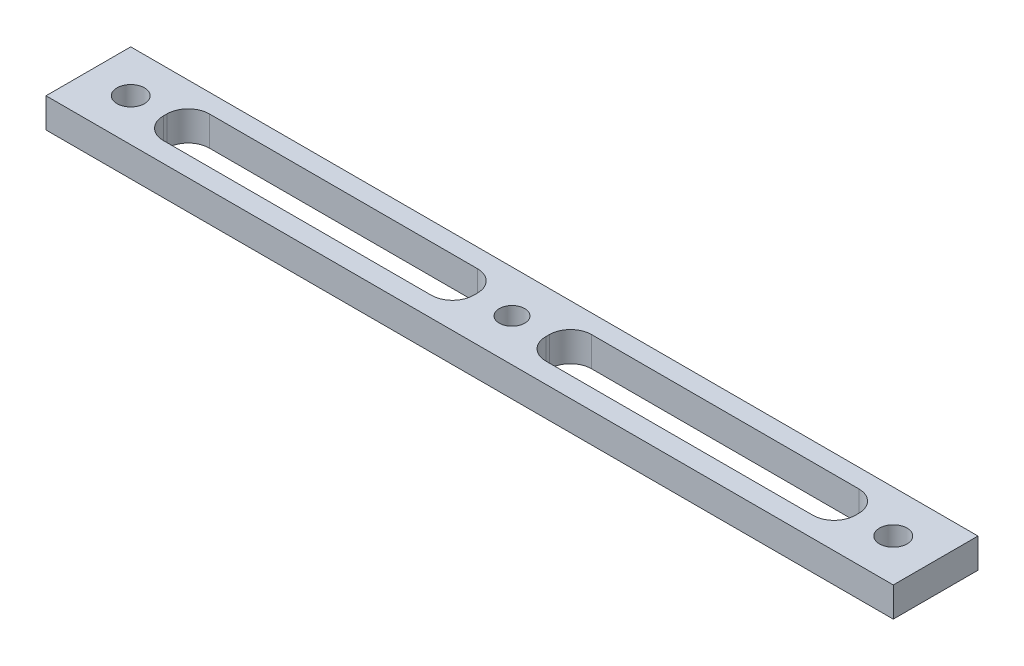
ISO-10303-21;
HEADER;
FILE_DESCRIPTION(('STEP AP214'),'2;1');
FILE_NAME('part.step','',(''),(''),'','','');
FILE_SCHEMA(('AUTOMOTIVE_DESIGN { 1 0 10303 214 1 1 1 1 }'));
ENDSEC;
DATA;
#1=APPLICATION_CONTEXT('core data for automotive mechanical design processes');
#2=APPLICATION_PROTOCOL_DEFINITION('international standard','automotive_design',2000,#1);
#3=PRODUCT_CONTEXT('',#1,'mechanical');
#4=PRODUCT('Part','Part','',(#3));
#5=PRODUCT_RELATED_PRODUCT_CATEGORY('part','',(#4));
#6=PRODUCT_DEFINITION_FORMATION('','',#4);
#7=PRODUCT_DEFINITION_CONTEXT('part definition',#1,'design');
#8=PRODUCT_DEFINITION('design','',#6,#7);
#9=PRODUCT_DEFINITION_SHAPE('','',#8);
#10=(LENGTH_UNIT() NAMED_UNIT(*) SI_UNIT(.MILLI.,.METRE.));
#11=(NAMED_UNIT(*) PLANE_ANGLE_UNIT() SI_UNIT($,.RADIAN.));
#12=(NAMED_UNIT(*) SI_UNIT($,.STERADIAN.) SOLID_ANGLE_UNIT());
#13=UNCERTAINTY_MEASURE_WITH_UNIT(LENGTH_MEASURE(1.E-05),#10,'distance_accuracy_value','');
#14=(GEOMETRIC_REPRESENTATION_CONTEXT(3) GLOBAL_UNCERTAINTY_ASSIGNED_CONTEXT((#13)) GLOBAL_UNIT_ASSIGNED_CONTEXT((#10,
#11,#12)) REPRESENTATION_CONTEXT('',''));
#15=CARTESIAN_POINT('',(0.,0.,0.));
#16=DIRECTION('',(0.,0.,1.));
#17=DIRECTION('',(1.,0.,0.));
#18=AXIS2_PLACEMENT_3D('',#15,#16,#17);
#19=CARTESIAN_POINT('',(0.,7.,0.));
#20=DIRECTION('',(0.,0.,-1.));
#21=DIRECTION('',(-1.,0.,0.));
#22=AXIS2_PLACEMENT_3D('',#19,#20,#21);
#23=PLANE('',#22);
#24=DIRECTION('',(1.,0.,0.));
#25=VECTOR('',#24,1.);
#26=CARTESIAN_POINT('',(0.,0.,0.));
#27=LINE('',#26,#25);
#28=CARTESIAN_POINT('',(0.,0.,0.));
#29=VERTEX_POINT('',#28);
#30=CARTESIAN_POINT('',(200.,0.,0.));
#31=VERTEX_POINT('',#30);
#32=EDGE_CURVE('E293',#29,#31,#27,.T.);
#33=ORIENTED_EDGE('',*,*,#32,.T.);
#34=DIRECTION('',(0.,-1.,0.));
#35=VECTOR('',#34,1.);
#36=CARTESIAN_POINT('',(200.,7.,0.));
#37=LINE('',#36,#35);
#38=CARTESIAN_POINT('',(200.,7.,0.));
#39=VERTEX_POINT('',#38);
#40=EDGE_CURVE('E11',#39,#31,#37,.T.);
#41=ORIENTED_EDGE('',*,*,#40,.F.);
#42=DIRECTION('',(1.,0.,0.));
#43=VECTOR('',#42,1.);
#44=CARTESIAN_POINT('',(0.,7.,0.));
#45=LINE('',#44,#43);
#46=CARTESIAN_POINT('',(0.,7.,0.));
#47=VERTEX_POINT('',#46);
#48=EDGE_CURVE('E196',#47,#39,#45,.T.);
#49=ORIENTED_EDGE('',*,*,#48,.F.);
#50=DIRECTION('',(0.,-1.,0.));
#51=VECTOR('',#50,1.);
#52=CARTESIAN_POINT('',(0.,7.,0.));
#53=LINE('',#52,#51);
#54=EDGE_CURVE('E64',#47,#29,#53,.T.);
#55=ORIENTED_EDGE('',*,*,#54,.T.);
#56=EDGE_LOOP('',(#33,#41,#49,#55));
#57=FACE_BOUND('',#56,.T.);
#58=ADVANCED_FACE('F44',(#57),#23,.F.);
#59=CARTESIAN_POINT('',(200.,7.,0.));
#60=DIRECTION('',(-1.,0.,0.));
#61=DIRECTION('',(0.,0.,1.));
#62=AXIS2_PLACEMENT_3D('',#59,#60,#61);
#63=PLANE('',#62);
#64=DIRECTION('',(0.,0.,-1.));
#65=VECTOR('',#64,1.);
#66=CARTESIAN_POINT('',(200.,0.,0.));
#67=LINE('',#66,#65);
#68=CARTESIAN_POINT('',(200.,0.,-20.));
#69=VERTEX_POINT('',#68);
#70=EDGE_CURVE('E203',#31,#69,#67,.T.);
#71=ORIENTED_EDGE('',*,*,#70,.T.);
#72=DIRECTION('',(0.,-1.,0.));
#73=VECTOR('',#72,1.);
#74=CARTESIAN_POINT('',(200.,7.,-20.));
#75=LINE('',#74,#73);
#76=CARTESIAN_POINT('',(200.,7.,-20.));
#77=VERTEX_POINT('',#76);
#78=EDGE_CURVE('E55',#77,#69,#75,.T.);
#79=ORIENTED_EDGE('',*,*,#78,.F.);
#80=DIRECTION('',(0.,0.,-1.));
#81=VECTOR('',#80,1.);
#82=CARTESIAN_POINT('',(200.,7.,0.));
#83=LINE('',#82,#81);
#84=EDGE_CURVE('E190',#39,#77,#83,.T.);
#85=ORIENTED_EDGE('',*,*,#84,.F.);
#86=ORIENTED_EDGE('',*,*,#40,.T.);
#87=EDGE_LOOP('',(#71,#79,#85,#86));
#88=FACE_BOUND('',#87,.T.);
#89=ADVANCED_FACE('F202',(#88),#63,.F.);
#90=CARTESIAN_POINT('',(0.,7.,-20.));
#91=DIRECTION('',(0.,0.,-1.));
#92=DIRECTION('',(-1.,0.,0.));
#93=AXIS2_PLACEMENT_3D('',#90,#91,#92);
#94=PLANE('',#93);
#95=DIRECTION('',(1.,0.,0.));
#96=VECTOR('',#95,1.);
#97=CARTESIAN_POINT('',(0.,0.,-20.));
#98=LINE('',#97,#96);
#99=CARTESIAN_POINT('',(0.,0.,-20.));
#100=VERTEX_POINT('',#99);
#101=EDGE_CURVE('E298',#100,#69,#98,.T.);
#102=ORIENTED_EDGE('',*,*,#101,.F.);
#103=DIRECTION('',(0.,-1.,0.));
#104=VECTOR('',#103,1.);
#105=CARTESIAN_POINT('',(0.,7.,-20.));
#106=LINE('',#105,#104);
#107=CARTESIAN_POINT('',(0.,7.,-20.));
#108=VERTEX_POINT('',#107);
#109=EDGE_CURVE('E126',#108,#100,#106,.T.);
#110=ORIENTED_EDGE('',*,*,#109,.F.);
#111=DIRECTION('',(1.,0.,0.));
#112=VECTOR('',#111,1.);
#113=CARTESIAN_POINT('',(0.,7.,-20.));
#114=LINE('',#113,#112);
#115=EDGE_CURVE('E195',#108,#77,#114,.T.);
#116=ORIENTED_EDGE('',*,*,#115,.T.);
#117=ORIENTED_EDGE('',*,*,#78,.T.);
#118=EDGE_LOOP('',(#102,#110,#116,#117));
#119=FACE_BOUND('',#118,.T.);
#120=ADVANCED_FACE('F208',(#119),#94,.T.);
#121=CARTESIAN_POINT('',(113.225148065724,7.,-10.5745762799879));
#122=DIRECTION('',(0.,-1.,0.));
#123=DIRECTION('',(0.,0.,-1.));
#124=AXIS2_PLACEMENT_3D('',#121,#122,#123);
#125=CYLINDRICAL_SURFACE('',#124,5.);
#126=CARTESIAN_POINT('',(113.225148065724,0.,-10.5745762799879));
#127=DIRECTION('',(0.,1.,0.));
#128=DIRECTION('',(0.,0.,1.));
#129=AXIS2_PLACEMENT_3D('',#126,#127,#128);
#130=CIRCLE('',#129,5.);
#131=CARTESIAN_POINT('',(113.225148065724,0.,-15.5745762799879));
#132=VERTEX_POINT('',#131);
#133=CARTESIAN_POINT('',(108.225148065724,0.,-10.5745762799879));
#134=VERTEX_POINT('',#133);
#135=EDGE_CURVE('E261',#132,#134,#130,.T.);
#136=ORIENTED_EDGE('',*,*,#135,.F.);
#137=DIRECTION('',(0.,-1.,0.));
#138=VECTOR('',#137,1.);
#139=CARTESIAN_POINT('',(113.225148065724,7.,-15.5745762799879));
#140=LINE('',#139,#138);
#141=CARTESIAN_POINT('',(113.225148065724,7.,-15.5745762799879));
#142=VERTEX_POINT('',#141);
#143=EDGE_CURVE('E308',#142,#132,#140,.T.);
#144=ORIENTED_EDGE('',*,*,#143,.F.);
#145=CARTESIAN_POINT('',(113.225148065724,7.,-10.5745762799879));
#146=DIRECTION('',(0.,1.,0.));
#147=DIRECTION('',(0.,0.,1.));
#148=AXIS2_PLACEMENT_3D('',#145,#146,#147);
#149=CIRCLE('',#148,5.);
#150=CARTESIAN_POINT('',(108.225148065724,7.,-10.5745762799879));
#151=VERTEX_POINT('',#150);
#152=EDGE_CURVE('E418',#142,#151,#149,.T.);
#153=ORIENTED_EDGE('',*,*,#152,.T.);
#154=DIRECTION('',(0.,-1.,0.));
#155=VECTOR('',#154,1.);
#156=CARTESIAN_POINT('',(108.225148065724,7.,-10.5745762799879));
#157=LINE('',#156,#155);
#158=EDGE_CURVE('E311',#151,#134,#157,.T.);
#159=ORIENTED_EDGE('',*,*,#158,.T.);
#160=EDGE_LOOP('',(#136,#144,#153,#159));
#161=FACE_BOUND('',#160,.T.);
#162=ADVANCED_FACE('F464',(#161),#125,.F.);
#163=CARTESIAN_POINT('',(0.,7.,-15.5745762799879));
#164=DIRECTION('',(0.,0.,-1.));
#165=DIRECTION('',(-1.,0.,0.));
#166=AXIS2_PLACEMENT_3D('',#163,#164,#165);
#167=PLANE('',#166);
#168=DIRECTION('',(1.,0.,0.));
#169=VECTOR('',#168,1.);
#170=CARTESIAN_POINT('',(0.,0.,-15.5745762799879));
#171=LINE('',#170,#169);
#172=CARTESIAN_POINT('',(176.28620966279,0.,-15.5745762799879));
#173=VERTEX_POINT('',#172);
#174=EDGE_CURVE('E265',#132,#173,#171,.T.);
#175=ORIENTED_EDGE('',*,*,#174,.T.);
#176=DIRECTION('',(0.,-1.,0.));
#177=VECTOR('',#176,1.);
#178=CARTESIAN_POINT('',(176.28620966279,7.,-15.5745762799879));
#179=LINE('',#178,#177);
#180=CARTESIAN_POINT('',(176.28620966279,7.,-15.5745762799879));
#181=VERTEX_POINT('',#180);
#182=EDGE_CURVE('E329',#181,#173,#179,.T.);
#183=ORIENTED_EDGE('',*,*,#182,.F.);
#184=DIRECTION('',(1.,0.,0.));
#185=VECTOR('',#184,1.);
#186=CARTESIAN_POINT('',(0.,7.,-15.5745762799879));
#187=LINE('',#186,#185);
#188=EDGE_CURVE('E422',#142,#181,#187,.T.);
#189=ORIENTED_EDGE('',*,*,#188,.F.);
#190=ORIENTED_EDGE('',*,*,#143,.T.);
#191=EDGE_LOOP('',(#175,#183,#189,#190));
#192=FACE_BOUND('',#191,.T.);
#193=ADVANCED_FACE('F468',(#192),#167,.F.);
#194=CARTESIAN_POINT('',(176.28620966279,7.,-10.5745762799879));
#195=DIRECTION('',(0.,-1.,0.));
#196=DIRECTION('',(0.,0.,-1.));
#197=AXIS2_PLACEMENT_3D('',#194,#195,#196);
#198=CYLINDRICAL_SURFACE('',#197,5.);
#199=CARTESIAN_POINT('',(176.28620966279,0.,-10.5745762799879));
#200=DIRECTION('',(0.,1.,0.));
#201=DIRECTION('',(0.,0.,1.));
#202=AXIS2_PLACEMENT_3D('',#199,#200,#201);
#203=CIRCLE('',#202,5.);
#204=CARTESIAN_POINT('',(181.28620966279,0.,-10.5745762799879));
#205=VERTEX_POINT('',#204);
#206=EDGE_CURVE('E269',#205,#173,#203,.T.);
#207=ORIENTED_EDGE('',*,*,#206,.F.);
#208=DIRECTION('',(0.,-1.,0.));
#209=VECTOR('',#208,1.);
#210=CARTESIAN_POINT('',(181.28620966279,7.,-10.5745762799879));
#211=LINE('',#210,#209);
#212=CARTESIAN_POINT('',(181.28620966279,7.,-10.5745762799879));
#213=VERTEX_POINT('',#212);
#214=EDGE_CURVE('E326',#213,#205,#211,.T.);
#215=ORIENTED_EDGE('',*,*,#214,.F.);
#216=CARTESIAN_POINT('',(176.28620966279,7.,-10.5745762799879));
#217=DIRECTION('',(0.,1.,0.));
#218=DIRECTION('',(0.,0.,1.));
#219=AXIS2_PLACEMENT_3D('',#216,#217,#218);
#220=CIRCLE('',#219,5.);
#221=EDGE_CURVE('E425',#213,#181,#220,.T.);
#222=ORIENTED_EDGE('',*,*,#221,.T.);
#223=ORIENTED_EDGE('',*,*,#182,.T.);
#224=EDGE_LOOP('',(#207,#215,#222,#223));
#225=FACE_BOUND('',#224,.T.);
#226=ADVANCED_FACE('F474',(#225),#198,.F.);
#227=CARTESIAN_POINT('',(181.28620966279,7.,0.));
#228=DIRECTION('',(1.,0.,0.));
#229=DIRECTION('',(0.,0.,-1.));
#230=AXIS2_PLACEMENT_3D('',#227,#228,#229);
#231=PLANE('',#230);
#232=DIRECTION('',(0.,0.,1.));
#233=VECTOR('',#232,1.);
#234=CARTESIAN_POINT('',(181.28620966279,0.,0.));
#235=LINE('',#234,#233);
#236=CARTESIAN_POINT('',(181.28620966279,0.,-9.75277634577931));
#237=VERTEX_POINT('',#236);
#238=EDGE_CURVE('E273',#205,#237,#235,.T.);
#239=ORIENTED_EDGE('',*,*,#238,.T.);
#240=DIRECTION('',(0.,-1.,0.));
#241=VECTOR('',#240,1.);
#242=CARTESIAN_POINT('',(181.28620966279,7.,-9.75277634577931));
#243=LINE('',#242,#241);
#244=CARTESIAN_POINT('',(181.28620966279,7.,-9.75277634577931));
#245=VERTEX_POINT('',#244);
#246=EDGE_CURVE('E323',#245,#237,#243,.T.);
#247=ORIENTED_EDGE('',*,*,#246,.F.);
#248=DIRECTION('',(0.,0.,1.));
#249=VECTOR('',#248,1.);
#250=CARTESIAN_POINT('',(181.28620966279,7.,0.));
#251=LINE('',#250,#249);
#252=EDGE_CURVE('E429',#213,#245,#251,.T.);
#253=ORIENTED_EDGE('',*,*,#252,.F.);
#254=ORIENTED_EDGE('',*,*,#214,.T.);
#255=EDGE_LOOP('',(#239,#247,#253,#254));
#256=FACE_BOUND('',#255,.T.);
#257=ADVANCED_FACE('F477',(#256),#231,.F.);
#258=CARTESIAN_POINT('',(176.28620966279,7.,-9.75277634577931));
#259=DIRECTION('',(0.,-1.,0.));
#260=DIRECTION('',(0.,0.,-1.));
#261=AXIS2_PLACEMENT_3D('',#258,#259,#260);
#262=CYLINDRICAL_SURFACE('',#261,5.);
#263=CARTESIAN_POINT('',(176.28620966279,0.,-9.75277634577931));
#264=DIRECTION('',(0.,1.,0.));
#265=DIRECTION('',(0.,0.,1.));
#266=AXIS2_PLACEMENT_3D('',#263,#264,#265);
#267=CIRCLE('',#266,5.);
#268=CARTESIAN_POINT('',(176.28620966279,0.,-4.75277634577932));
#269=VERTEX_POINT('',#268);
#270=EDGE_CURVE('E277',#269,#237,#267,.T.);
#271=ORIENTED_EDGE('',*,*,#270,.F.);
#272=DIRECTION('',(0.,-1.,0.));
#273=VECTOR('',#272,1.);
#274=CARTESIAN_POINT('',(176.28620966279,7.,-4.75277634577932));
#275=LINE('',#274,#273);
#276=CARTESIAN_POINT('',(176.28620966279,7.,-4.75277634577932));
#277=VERTEX_POINT('',#276);
#278=EDGE_CURVE('E320',#277,#269,#275,.T.);
#279=ORIENTED_EDGE('',*,*,#278,.F.);
#280=CARTESIAN_POINT('',(176.28620966279,7.,-9.75277634577931));
#281=DIRECTION('',(0.,1.,0.));
#282=DIRECTION('',(0.,0.,1.));
#283=AXIS2_PLACEMENT_3D('',#280,#281,#282);
#284=CIRCLE('',#283,5.);
#285=EDGE_CURVE('E432',#277,#245,#284,.T.);
#286=ORIENTED_EDGE('',*,*,#285,.T.);
#287=ORIENTED_EDGE('',*,*,#246,.T.);
#288=EDGE_LOOP('',(#271,#279,#286,#287));
#289=FACE_BOUND('',#288,.T.);
#290=ADVANCED_FACE('F480',(#289),#262,.F.);
#291=CARTESIAN_POINT('',(0.,7.,-4.75277634577932));
#292=DIRECTION('',(0.,0.,-1.));
#293=DIRECTION('',(-1.,0.,0.));
#294=AXIS2_PLACEMENT_3D('',#291,#292,#293);
#295=PLANE('',#294);
#296=DIRECTION('',(1.,0.,0.));
#297=VECTOR('',#296,1.);
#298=CARTESIAN_POINT('',(0.,0.,-4.75277634577932));
#299=LINE('',#298,#297);
#300=CARTESIAN_POINT('',(113.225148065724,0.,-4.75277634577932));
#301=VERTEX_POINT('',#300);
#302=EDGE_CURVE('E281',#301,#269,#299,.T.);
#303=ORIENTED_EDGE('',*,*,#302,.F.);
#304=DIRECTION('',(0.,-1.,0.));
#305=VECTOR('',#304,1.);
#306=CARTESIAN_POINT('',(113.225148065724,7.,-4.75277634577932));
#307=LINE('',#306,#305);
#308=CARTESIAN_POINT('',(113.225148065724,7.,-4.75277634577932));
#309=VERTEX_POINT('',#308);
#310=EDGE_CURVE('E317',#309,#301,#307,.T.);
#311=ORIENTED_EDGE('',*,*,#310,.F.);
#312=DIRECTION('',(1.,0.,0.));
#313=VECTOR('',#312,1.);
#314=CARTESIAN_POINT('',(0.,7.,-4.75277634577932));
#315=LINE('',#314,#313);
#316=EDGE_CURVE('E436',#309,#277,#315,.T.);
#317=ORIENTED_EDGE('',*,*,#316,.T.);
#318=ORIENTED_EDGE('',*,*,#278,.T.);
#319=EDGE_LOOP('',(#303,#311,#317,#318));
#320=FACE_BOUND('',#319,.T.);
#321=ADVANCED_FACE('F482',(#320),#295,.T.);
#322=CARTESIAN_POINT('',(113.225148065724,7.,-9.75277634577931));
#323=DIRECTION('',(0.,-1.,0.));
#324=DIRECTION('',(0.,0.,-1.));
#325=AXIS2_PLACEMENT_3D('',#322,#323,#324);
#326=CYLINDRICAL_SURFACE('',#325,5.);
#327=CARTESIAN_POINT('',(113.225148065724,0.,-9.75277634577931));
#328=DIRECTION('',(0.,1.,0.));
#329=DIRECTION('',(0.,0.,1.));
#330=AXIS2_PLACEMENT_3D('',#327,#328,#329);
#331=CIRCLE('',#330,5.);
#332=CARTESIAN_POINT('',(108.225148065724,0.,-9.75277634577931));
#333=VERTEX_POINT('',#332);
#334=EDGE_CURVE('E285',#301,#333,#331,.F.);
#335=ORIENTED_EDGE('',*,*,#334,.T.);
#336=DIRECTION('',(0.,-1.,0.));
#337=VECTOR('',#336,1.);
#338=CARTESIAN_POINT('',(108.225148065724,7.,-9.75277634577931));
#339=LINE('',#338,#337);
#340=CARTESIAN_POINT('',(108.225148065724,7.,-9.75277634577931));
#341=VERTEX_POINT('',#340);
#342=EDGE_CURVE('E314',#341,#333,#339,.T.);
#343=ORIENTED_EDGE('',*,*,#342,.F.);
#344=CARTESIAN_POINT('',(113.225148065724,7.,-9.75277634577931));
#345=DIRECTION('',(0.,1.,0.));
#346=DIRECTION('',(0.,0.,1.));
#347=AXIS2_PLACEMENT_3D('',#344,#345,#346);
#348=CIRCLE('',#347,5.);
#349=EDGE_CURVE('E440',#309,#341,#348,.F.);
#350=ORIENTED_EDGE('',*,*,#349,.F.);
#351=ORIENTED_EDGE('',*,*,#310,.T.);
#352=EDGE_LOOP('',(#335,#343,#350,#351));
#353=FACE_BOUND('',#352,.T.);
#354=ADVANCED_FACE('F457',(#353),#326,.F.);
#355=CARTESIAN_POINT('',(22.9848223233018,7.,-10.5745762799879));
#356=DIRECTION('',(0.,-1.,0.));
#357=DIRECTION('',(0.,0.,-1.));
#358=AXIS2_PLACEMENT_3D('',#355,#356,#357);
#359=CYLINDRICAL_SURFACE('',#358,5.);
#360=CARTESIAN_POINT('',(22.9848223233018,0.,-10.5745762799879));
#361=DIRECTION('',(0.,1.,0.));
#362=DIRECTION('',(0.,0.,1.));
#363=AXIS2_PLACEMENT_3D('',#360,#361,#362);
#364=CIRCLE('',#363,5.);
#365=CARTESIAN_POINT('',(22.9848223233018,0.,-15.5745762799879));
#366=VERTEX_POINT('',#365);
#367=CARTESIAN_POINT('',(17.9848223233018,0.,-10.5745762799879));
#368=VERTEX_POINT('',#367);
#369=EDGE_CURVE('E229',#366,#368,#364,.T.);
#370=ORIENTED_EDGE('',*,*,#369,.F.);
#371=DIRECTION('',(0.,-1.,0.));
#372=VECTOR('',#371,1.);
#373=CARTESIAN_POINT('',(22.9848223233018,7.,-15.5745762799879));
#374=LINE('',#373,#372);
#375=CARTESIAN_POINT('',(22.9848223233018,7.,-15.5745762799879));
#376=VERTEX_POINT('',#375);
#377=EDGE_CURVE('E48',#376,#366,#374,.T.);
#378=ORIENTED_EDGE('',*,*,#377,.F.);
#379=CARTESIAN_POINT('',(22.9848223233018,7.,-10.5745762799879));
#380=DIRECTION('',(0.,1.,0.));
#381=DIRECTION('',(0.,0.,1.));
#382=AXIS2_PLACEMENT_3D('',#379,#380,#381);
#383=CIRCLE('',#382,5.);
#384=CARTESIAN_POINT('',(17.9848223233018,7.,-10.5745762799879));
#385=VERTEX_POINT('',#384);
#386=EDGE_CURVE('E368',#376,#385,#383,.T.);
#387=ORIENTED_EDGE('',*,*,#386,.T.);
#388=DIRECTION('',(0.,-1.,0.));
#389=VECTOR('',#388,1.);
#390=CARTESIAN_POINT('',(17.9848223233018,7.,-10.5745762799879));
#391=LINE('',#390,#389);
#392=EDGE_CURVE('E213',#385,#368,#391,.T.);
#393=ORIENTED_EDGE('',*,*,#392,.T.);
#394=EDGE_LOOP('',(#370,#378,#387,#393));
#395=FACE_BOUND('',#394,.T.);
#396=ADVANCED_FACE('F367',(#395),#359,.F.);
#397=CARTESIAN_POINT('',(0.,7.,-15.5745762799879));
#398=DIRECTION('',(0.,0.,-1.));
#399=DIRECTION('',(-1.,0.,0.));
#400=AXIS2_PLACEMENT_3D('',#397,#398,#399);
#401=PLANE('',#400);
#402=DIRECTION('',(1.,0.,0.));
#403=VECTOR('',#402,1.);
#404=CARTESIAN_POINT('',(0.,0.,-15.5745762799879));
#405=LINE('',#404,#403);
#406=CARTESIAN_POINT('',(86.2593923796302,0.,-15.5745762799879));
#407=VERTEX_POINT('',#406);
#408=EDGE_CURVE('E233',#366,#407,#405,.T.);
#409=ORIENTED_EDGE('',*,*,#408,.T.);
#410=DIRECTION('',(0.,-1.,0.));
#411=VECTOR('',#410,1.);
#412=CARTESIAN_POINT('',(86.2593923796302,7.,-15.5745762799879));
#413=LINE('',#412,#411);
#414=CARTESIAN_POINT('',(86.2593923796302,7.,-15.5745762799879));
#415=VERTEX_POINT('',#414);
#416=EDGE_CURVE('E350',#415,#407,#413,.T.);
#417=ORIENTED_EDGE('',*,*,#416,.F.);
#418=DIRECTION('',(1.,0.,0.));
#419=VECTOR('',#418,1.);
#420=CARTESIAN_POINT('',(0.,7.,-15.5745762799879));
#421=LINE('',#420,#419);
#422=EDGE_CURVE('E360',#376,#415,#421,.T.);
#423=ORIENTED_EDGE('',*,*,#422,.F.);
#424=ORIENTED_EDGE('',*,*,#377,.T.);
#425=EDGE_LOOP('',(#409,#417,#423,#424));
#426=FACE_BOUND('',#425,.T.);
#427=ADVANCED_FACE('F359',(#426),#401,.F.);
#428=CARTESIAN_POINT('',(86.2593923796302,7.,-10.5745762799879));
#429=DIRECTION('',(0.,-1.,0.));
#430=DIRECTION('',(0.,0.,-1.));
#431=AXIS2_PLACEMENT_3D('',#428,#429,#430);
#432=CYLINDRICAL_SURFACE('',#431,5.);
#433=CARTESIAN_POINT('',(86.2593923796302,0.,-10.5745762799879));
#434=DIRECTION('',(0.,1.,0.));
#435=DIRECTION('',(0.,0.,1.));
#436=AXIS2_PLACEMENT_3D('',#433,#434,#435);
#437=CIRCLE('',#436,5.);
#438=CARTESIAN_POINT('',(91.2593923796302,0.,-10.5745762799879));
#439=VERTEX_POINT('',#438);
#440=EDGE_CURVE('E237',#439,#407,#437,.T.);
#441=ORIENTED_EDGE('',*,*,#440,.F.);
#442=DIRECTION('',(0.,-1.,0.));
#443=VECTOR('',#442,1.);
#444=CARTESIAN_POINT('',(91.2593923796302,7.,-10.5745762799879));
#445=LINE('',#444,#443);
#446=CARTESIAN_POINT('',(91.2593923796302,7.,-10.5745762799879));
#447=VERTEX_POINT('',#446);
#448=EDGE_CURVE('E348',#447,#439,#445,.T.);
#449=ORIENTED_EDGE('',*,*,#448,.F.);
#450=CARTESIAN_POINT('',(86.2593923796302,7.,-10.5745762799879));
#451=DIRECTION('',(0.,1.,0.));
#452=DIRECTION('',(0.,0.,1.));
#453=AXIS2_PLACEMENT_3D('',#450,#451,#452);
#454=CIRCLE('',#453,5.);
#455=EDGE_CURVE('E396',#447,#415,#454,.T.);
#456=ORIENTED_EDGE('',*,*,#455,.T.);
#457=ORIENTED_EDGE('',*,*,#416,.T.);
#458=EDGE_LOOP('',(#441,#449,#456,#457));
#459=FACE_BOUND('',#458,.T.);
#460=ADVANCED_FACE('F393',(#459),#432,.F.);
#461=CARTESIAN_POINT('',(91.2593923796302,7.,0.));
#462=DIRECTION('',(1.,0.,0.));
#463=DIRECTION('',(0.,0.,-1.));
#464=AXIS2_PLACEMENT_3D('',#461,#462,#463);
#465=PLANE('',#464);
#466=DIRECTION('',(0.,0.,1.));
#467=VECTOR('',#466,1.);
#468=CARTESIAN_POINT('',(91.2593923796302,0.,0.));
#469=LINE('',#468,#467);
#470=CARTESIAN_POINT('',(91.2593923796302,0.,-9.69671937911454));
#471=VERTEX_POINT('',#470);
#472=EDGE_CURVE('E241',#439,#471,#469,.T.);
#473=ORIENTED_EDGE('',*,*,#472,.T.);
#474=DIRECTION('',(0.,-1.,0.));
#475=VECTOR('',#474,1.);
#476=CARTESIAN_POINT('',(91.2593923796302,7.,-9.69671937911454));
#477=LINE('',#476,#475);
#478=CARTESIAN_POINT('',(91.2593923796302,7.,-9.69671937911454));
#479=VERTEX_POINT('',#478);
#480=EDGE_CURVE('E345',#479,#471,#477,.T.);
#481=ORIENTED_EDGE('',*,*,#480,.F.);
#482=DIRECTION('',(0.,0.,1.));
#483=VECTOR('',#482,1.);
#484=CARTESIAN_POINT('',(91.2593923796302,7.,0.));
#485=LINE('',#484,#483);
#486=EDGE_CURVE('E397',#447,#479,#485,.T.);
#487=ORIENTED_EDGE('',*,*,#486,.F.);
#488=ORIENTED_EDGE('',*,*,#448,.T.);
#489=EDGE_LOOP('',(#473,#481,#487,#488));
#490=FACE_BOUND('',#489,.T.);
#491=ADVANCED_FACE('F398',(#490),#465,.F.);
#492=CARTESIAN_POINT('',(86.2593923796302,7.,-9.69671937911454));
#493=DIRECTION('',(0.,-1.,0.));
#494=DIRECTION('',(0.,0.,-1.));
#495=AXIS2_PLACEMENT_3D('',#492,#493,#494);
#496=CYLINDRICAL_SURFACE('',#495,5.);
#497=CARTESIAN_POINT('',(86.2593923796302,0.,-9.69671937911454));
#498=DIRECTION('',(0.,1.,0.));
#499=DIRECTION('',(0.,0.,1.));
#500=AXIS2_PLACEMENT_3D('',#497,#498,#499);
#501=CIRCLE('',#500,5.);
#502=CARTESIAN_POINT('',(86.2593923796302,0.,-4.69671937911453));
#503=VERTEX_POINT('',#502);
#504=EDGE_CURVE('E245',#503,#471,#501,.T.);
#505=ORIENTED_EDGE('',*,*,#504,.F.);
#506=DIRECTION('',(0.,-1.,0.));
#507=VECTOR('',#506,1.);
#508=CARTESIAN_POINT('',(86.2593923796302,7.,-4.69671937911453));
#509=LINE('',#508,#507);
#510=CARTESIAN_POINT('',(86.2593923796302,7.,-4.69671937911453));
#511=VERTEX_POINT('',#510);
#512=EDGE_CURVE('E342',#511,#503,#509,.T.);
#513=ORIENTED_EDGE('',*,*,#512,.F.);
#514=CARTESIAN_POINT('',(86.2593923796302,7.,-9.69671937911454));
#515=DIRECTION('',(0.,1.,0.));
#516=DIRECTION('',(0.,0.,1.));
#517=AXIS2_PLACEMENT_3D('',#514,#515,#516);
#518=CIRCLE('',#517,5.);
#519=EDGE_CURVE('E401',#511,#479,#518,.T.);
#520=ORIENTED_EDGE('',*,*,#519,.T.);
#521=ORIENTED_EDGE('',*,*,#480,.T.);
#522=EDGE_LOOP('',(#505,#513,#520,#521));
#523=FACE_BOUND('',#522,.T.);
#524=ADVANCED_FACE('F390',(#523),#496,.F.);
#525=CARTESIAN_POINT('',(0.,7.,-4.69671937911453));
#526=DIRECTION('',(0.,0.,-1.));
#527=DIRECTION('',(-1.,0.,0.));
#528=AXIS2_PLACEMENT_3D('',#525,#526,#527);
#529=PLANE('',#528);
#530=DIRECTION('',(1.,0.,0.));
#531=VECTOR('',#530,1.);
#532=CARTESIAN_POINT('',(0.,0.,-4.69671937911453));
#533=LINE('',#532,#531);
#534=CARTESIAN_POINT('',(22.9848223233018,0.,-4.69671937911453));
#535=VERTEX_POINT('',#534);
#536=EDGE_CURVE('E249',#535,#503,#533,.T.);
#537=ORIENTED_EDGE('',*,*,#536,.F.);
#538=DIRECTION('',(0.,-1.,0.));
#539=VECTOR('',#538,1.);
#540=CARTESIAN_POINT('',(22.9848223233018,7.,-4.69671937911453));
#541=LINE('',#540,#539);
#542=CARTESIAN_POINT('',(22.9848223233018,7.,-4.69671937911453));
#543=VERTEX_POINT('',#542);
#544=EDGE_CURVE('E339',#543,#535,#541,.T.);
#545=ORIENTED_EDGE('',*,*,#544,.F.);
#546=DIRECTION('',(1.,0.,0.));
#547=VECTOR('',#546,1.);
#548=CARTESIAN_POINT('',(0.,7.,-4.69671937911453));
#549=LINE('',#548,#547);
#550=EDGE_CURVE('E386',#543,#511,#549,.T.);
#551=ORIENTED_EDGE('',*,*,#550,.T.);
#552=ORIENTED_EDGE('',*,*,#512,.T.);
#553=EDGE_LOOP('',(#537,#545,#551,#552));
#554=FACE_BOUND('',#553,.T.);
#555=ADVANCED_FACE('F384',(#554),#529,.T.);
#556=CARTESIAN_POINT('',(22.9848223233018,7.,-9.69671937911454));
#557=DIRECTION('',(0.,-1.,0.));
#558=DIRECTION('',(0.,0.,-1.));
#559=AXIS2_PLACEMENT_3D('',#556,#557,#558);
#560=CYLINDRICAL_SURFACE('',#559,5.);
#561=CARTESIAN_POINT('',(22.9848223233018,0.,-9.69671937911454));
#562=DIRECTION('',(0.,1.,0.));
#563=DIRECTION('',(0.,0.,1.));
#564=AXIS2_PLACEMENT_3D('',#561,#562,#563);
#565=CIRCLE('',#564,5.);
#566=CARTESIAN_POINT('',(17.9848223233018,0.,-9.69671937911454));
#567=VERTEX_POINT('',#566);
#568=EDGE_CURVE('E253',#567,#535,#565,.T.);
#569=ORIENTED_EDGE('',*,*,#568,.F.);
#570=DIRECTION('',(0.,-1.,0.));
#571=VECTOR('',#570,1.);
#572=CARTESIAN_POINT('',(17.9848223233018,7.,-9.69671937911454));
#573=LINE('',#572,#571);
#574=CARTESIAN_POINT('',(17.9848223233018,7.,-9.69671937911454));
#575=VERTEX_POINT('',#574);
#576=EDGE_CURVE('E336',#575,#567,#573,.T.);
#577=ORIENTED_EDGE('',*,*,#576,.F.);
#578=CARTESIAN_POINT('',(22.9848223233018,7.,-9.69671937911454));
#579=DIRECTION('',(0.,1.,0.));
#580=DIRECTION('',(0.,0.,1.));
#581=AXIS2_PLACEMENT_3D('',#578,#579,#580);
#582=CIRCLE('',#581,5.);
#583=EDGE_CURVE('E380',#575,#543,#582,.T.);
#584=ORIENTED_EDGE('',*,*,#583,.T.);
#585=ORIENTED_EDGE('',*,*,#544,.T.);
#586=EDGE_LOOP('',(#569,#577,#584,#585));
#587=FACE_BOUND('',#586,.T.);
#588=ADVANCED_FACE('F377',(#587),#560,.F.);
#589=CARTESIAN_POINT('',(108.225148065724,7.,0.));
#590=DIRECTION('',(1.,0.,0.));
#591=DIRECTION('',(0.,0.,-1.));
#592=AXIS2_PLACEMENT_3D('',#589,#590,#591);
#593=PLANE('',#592);
#594=DIRECTION('',(0.,0.,1.));
#595=VECTOR('',#594,1.);
#596=CARTESIAN_POINT('',(108.225148065724,0.,0.));
#597=LINE('',#596,#595);
#598=EDGE_CURVE('E289',#134,#333,#597,.T.);
#599=ORIENTED_EDGE('',*,*,#598,.F.);
#600=ORIENTED_EDGE('',*,*,#158,.F.);
#601=DIRECTION('',(0.,0.,1.));
#602=VECTOR('',#601,1.);
#603=CARTESIAN_POINT('',(108.225148065724,7.,0.));
#604=LINE('',#603,#602);
#605=EDGE_CURVE('E443',#151,#341,#604,.T.);
#606=ORIENTED_EDGE('',*,*,#605,.T.);
#607=ORIENTED_EDGE('',*,*,#342,.T.);
#608=EDGE_LOOP('',(#599,#600,#606,#607));
#609=FACE_BOUND('',#608,.T.);
#610=ADVANCED_FACE('F450',(#609),#593,.T.);
#611=CARTESIAN_POINT('',(17.9848223233018,7.,0.));
#612=DIRECTION('',(1.,0.,0.));
#613=DIRECTION('',(0.,0.,-1.));
#614=AXIS2_PLACEMENT_3D('',#611,#612,#613);
#615=PLANE('',#614);
#616=DIRECTION('',(0.,0.,1.));
#617=VECTOR('',#616,1.);
#618=CARTESIAN_POINT('',(17.9848223233018,0.,0.));
#619=LINE('',#618,#617);
#620=EDGE_CURVE('E257',#368,#567,#619,.T.);
#621=ORIENTED_EDGE('',*,*,#620,.F.);
#622=ORIENTED_EDGE('',*,*,#392,.F.);
#623=DIRECTION('',(0.,0.,1.));
#624=VECTOR('',#623,1.);
#625=CARTESIAN_POINT('',(17.9848223233018,7.,0.));
#626=LINE('',#625,#624);
#627=EDGE_CURVE('E373',#385,#575,#626,.T.);
#628=ORIENTED_EDGE('',*,*,#627,.T.);
#629=ORIENTED_EDGE('',*,*,#576,.T.);
#630=EDGE_LOOP('',(#621,#622,#628,#629));
#631=FACE_BOUND('',#630,.T.);
#632=ADVANCED_FACE('F372',(#631),#615,.T.);
#633=CARTESIAN_POINT('',(100.,7.,-9.99999999999999));
#634=DIRECTION('',(0.,-1.,0.));
#635=DIRECTION('',(0.,0.,-1.));
#636=AXIS2_PLACEMENT_3D('',#633,#634,#635);
#637=CYLINDRICAL_SURFACE('',#636,3.00000000000001);
#638=CARTESIAN_POINT('',(100.,7.,-9.99999999999999));
#639=DIRECTION('',(0.,1.,0.));
#640=DIRECTION('',(0.,0.,1.));
#641=AXIS2_PLACEMENT_3D('',#638,#639,#640);
#642=CIRCLE('',#641,3.00000000000001);
#643=CARTESIAN_POINT('',(100.,7.,-6.99999999999998));
#644=VERTEX_POINT('',#643);
#645=EDGE_CURVE('E756',#644,#644,#642,.T.);
#646=ORIENTED_EDGE('',*,*,#645,.T.);
#647=EDGE_LOOP('',(#646));
#648=FACE_BOUND('',#647,.T.);
#649=CARTESIAN_POINT('',(100.,0.,-9.99999999999999));
#650=DIRECTION('',(0.,1.,0.));
#651=DIRECTION('',(0.,0.,1.));
#652=AXIS2_PLACEMENT_3D('',#649,#650,#651);
#653=CIRCLE('',#652,3.00000000000001);
#654=CARTESIAN_POINT('',(100.,0.,-6.99999999999998));
#655=VERTEX_POINT('',#654);
#656=EDGE_CURVE('E225',#655,#655,#653,.T.);
#657=ORIENTED_EDGE('',*,*,#656,.F.);
#658=EDGE_LOOP('',(#657));
#659=FACE_BOUND('',#658,.T.);
#660=ADVANCED_FACE('F504',(#648,#659),#637,.F.);
#661=CARTESIAN_POINT('',(10.,7.,-10.));
#662=DIRECTION('',(0.,-1.,0.));
#663=DIRECTION('',(0.,0.,-1.));
#664=AXIS2_PLACEMENT_3D('',#661,#662,#663);
#665=CYLINDRICAL_SURFACE('',#664,3.25);
#666=CARTESIAN_POINT('',(10.,7.,-10.));
#667=DIRECTION('',(0.,1.,0.));
#668=DIRECTION('',(0.,0.,1.));
#669=AXIS2_PLACEMENT_3D('',#666,#667,#668);
#670=CIRCLE('',#669,3.25);
#671=CARTESIAN_POINT('',(10.,7.,-6.75));
#672=VERTEX_POINT('',#671);
#673=EDGE_CURVE('E536',#672,#672,#670,.T.);
#674=ORIENTED_EDGE('',*,*,#673,.T.);
#675=EDGE_LOOP('',(#674));
#676=FACE_BOUND('',#675,.T.);
#677=CARTESIAN_POINT('',(10.,0.,-10.));
#678=DIRECTION('',(0.,1.,0.));
#679=DIRECTION('',(0.,0.,1.));
#680=AXIS2_PLACEMENT_3D('',#677,#678,#679);
#681=CIRCLE('',#680,3.25);
#682=CARTESIAN_POINT('',(10.,0.,-6.75));
#683=VERTEX_POINT('',#682);
#684=EDGE_CURVE('E221',#683,#683,#681,.T.);
#685=ORIENTED_EDGE('',*,*,#684,.F.);
#686=EDGE_LOOP('',(#685));
#687=FACE_BOUND('',#686,.T.);
#688=ADVANCED_FACE('F524',(#676,#687),#665,.F.);
#689=CARTESIAN_POINT('',(190.,7.,-10.));
#690=DIRECTION('',(0.,-1.,0.));
#691=DIRECTION('',(0.,0.,-1.));
#692=AXIS2_PLACEMENT_3D('',#689,#690,#691);
#693=CYLINDRICAL_SURFACE('',#692,3.25000000000001);
#694=CARTESIAN_POINT('',(190.,7.,-10.));
#695=DIRECTION('',(0.,1.,0.));
#696=DIRECTION('',(0.,0.,1.));
#697=AXIS2_PLACEMENT_3D('',#694,#695,#696);
#698=CIRCLE('',#697,3.25000000000001);
#699=CARTESIAN_POINT('',(190.,7.,-6.74999999999999));
#700=VERTEX_POINT('',#699);
#701=EDGE_CURVE('E305',#700,#700,#698,.T.);
#702=ORIENTED_EDGE('',*,*,#701,.T.);
#703=EDGE_LOOP('',(#702));
#704=FACE_BOUND('',#703,.T.);
#705=CARTESIAN_POINT('',(190.,0.,-10.));
#706=DIRECTION('',(0.,1.,0.));
#707=DIRECTION('',(0.,0.,1.));
#708=AXIS2_PLACEMENT_3D('',#705,#706,#707);
#709=CIRCLE('',#708,3.25000000000001);
#710=CARTESIAN_POINT('',(190.,0.,-6.74999999999999));
#711=VERTEX_POINT('',#710);
#712=EDGE_CURVE('E217',#711,#711,#709,.T.);
#713=ORIENTED_EDGE('',*,*,#712,.F.);
#714=EDGE_LOOP('',(#713));
#715=FACE_BOUND('',#714,.T.);
#716=ADVANCED_FACE('F46',(#704,#715),#693,.F.);
#717=CARTESIAN_POINT('',(0.,7.,0.));
#718=DIRECTION('',(-1.,0.,0.));
#719=DIRECTION('',(0.,0.,1.));
#720=AXIS2_PLACEMENT_3D('',#717,#718,#719);
#721=PLANE('',#720);
#722=DIRECTION('',(0.,0.,-1.));
#723=VECTOR('',#722,1.);
#724=CARTESIAN_POINT('',(0.,0.,0.));
#725=LINE('',#724,#723);
#726=EDGE_CURVE('E301',#29,#100,#725,.T.);
#727=ORIENTED_EDGE('',*,*,#726,.F.);
#728=ORIENTED_EDGE('',*,*,#54,.F.);
#729=DIRECTION('',(0.,0.,-1.));
#730=VECTOR('',#729,1.);
#731=CARTESIAN_POINT('',(0.,7.,0.));
#732=LINE('',#731,#730);
#733=EDGE_CURVE('E210',#47,#108,#732,.T.);
#734=ORIENTED_EDGE('',*,*,#733,.T.);
#735=ORIENTED_EDGE('',*,*,#109,.T.);
#736=EDGE_LOOP('',(#727,#728,#734,#735));
#737=FACE_BOUND('',#736,.T.);
#738=ADVANCED_FACE('F531',(#737),#721,.T.);
#739=CARTESIAN_POINT('',(0.,7.,0.));
#740=DIRECTION('',(0.,1.,0.));
#741=DIRECTION('',(0.,0.,1.));
#742=AXIS2_PLACEMENT_3D('',#739,#740,#741);
#743=PLANE('',#742);
#744=ORIENTED_EDGE('',*,*,#701,.F.);
#745=EDGE_LOOP('',(#744));
#746=FACE_BOUND('',#745,.T.);
#747=ORIENTED_EDGE('',*,*,#673,.F.);
#748=EDGE_LOOP('',(#747));
#749=FACE_BOUND('',#748,.T.);
#750=ORIENTED_EDGE('',*,*,#645,.F.);
#751=EDGE_LOOP('',(#750));
#752=FACE_BOUND('',#751,.T.);
#753=ORIENTED_EDGE('',*,*,#386,.F.);
#754=ORIENTED_EDGE('',*,*,#422,.T.);
#755=ORIENTED_EDGE('',*,*,#455,.F.);
#756=ORIENTED_EDGE('',*,*,#486,.T.);
#757=ORIENTED_EDGE('',*,*,#519,.F.);
#758=ORIENTED_EDGE('',*,*,#550,.F.);
#759=ORIENTED_EDGE('',*,*,#583,.F.);
#760=ORIENTED_EDGE('',*,*,#627,.F.);
#761=EDGE_LOOP('',(#753,#754,#755,#756,#757,#758,#759,#760));
#762=FACE_BOUND('',#761,.T.);
#763=ORIENTED_EDGE('',*,*,#152,.F.);
#764=ORIENTED_EDGE('',*,*,#188,.T.);
#765=ORIENTED_EDGE('',*,*,#221,.F.);
#766=ORIENTED_EDGE('',*,*,#252,.T.);
#767=ORIENTED_EDGE('',*,*,#285,.F.);
#768=ORIENTED_EDGE('',*,*,#316,.F.);
#769=ORIENTED_EDGE('',*,*,#349,.T.);
#770=ORIENTED_EDGE('',*,*,#605,.F.);
#771=EDGE_LOOP('',(#763,#764,#765,#766,#767,#768,#769,#770));
#772=FACE_BOUND('',#771,.T.);
#773=ORIENTED_EDGE('',*,*,#48,.T.);
#774=ORIENTED_EDGE('',*,*,#84,.T.);
#775=ORIENTED_EDGE('',*,*,#115,.F.);
#776=ORIENTED_EDGE('',*,*,#733,.F.);
#777=EDGE_LOOP('',(#773,#774,#775,#776));
#778=FACE_BOUND('',#777,.T.);
#779=ADVANCED_FACE('F192',(#746,#749,#752,#762,#772,#778),#743,.T.);
#780=CARTESIAN_POINT('',(0.,0.,0.));
#781=DIRECTION('',(0.,1.,0.));
#782=DIRECTION('',(0.,0.,1.));
#783=AXIS2_PLACEMENT_3D('',#780,#781,#782);
#784=PLANE('',#783);
#785=ORIENTED_EDGE('',*,*,#712,.T.);
#786=EDGE_LOOP('',(#785));
#787=FACE_BOUND('',#786,.T.);
#788=ORIENTED_EDGE('',*,*,#684,.T.);
#789=EDGE_LOOP('',(#788));
#790=FACE_BOUND('',#789,.T.);
#791=ORIENTED_EDGE('',*,*,#656,.T.);
#792=EDGE_LOOP('',(#791));
#793=FACE_BOUND('',#792,.T.);
#794=ORIENTED_EDGE('',*,*,#369,.T.);
#795=ORIENTED_EDGE('',*,*,#620,.T.);
#796=ORIENTED_EDGE('',*,*,#568,.T.);
#797=ORIENTED_EDGE('',*,*,#536,.T.);
#798=ORIENTED_EDGE('',*,*,#504,.T.);
#799=ORIENTED_EDGE('',*,*,#472,.F.);
#800=ORIENTED_EDGE('',*,*,#440,.T.);
#801=ORIENTED_EDGE('',*,*,#408,.F.);
#802=EDGE_LOOP('',(#794,#795,#796,#797,#798,#799,#800,#801));
#803=FACE_BOUND('',#802,.T.);
#804=ORIENTED_EDGE('',*,*,#135,.T.);
#805=ORIENTED_EDGE('',*,*,#598,.T.);
#806=ORIENTED_EDGE('',*,*,#334,.F.);
#807=ORIENTED_EDGE('',*,*,#302,.T.);
#808=ORIENTED_EDGE('',*,*,#270,.T.);
#809=ORIENTED_EDGE('',*,*,#238,.F.);
#810=ORIENTED_EDGE('',*,*,#206,.T.);
#811=ORIENTED_EDGE('',*,*,#174,.F.);
#812=EDGE_LOOP('',(#804,#805,#806,#807,#808,#809,#810,#811));
#813=FACE_BOUND('',#812,.T.);
#814=ORIENTED_EDGE('',*,*,#32,.F.);
#815=ORIENTED_EDGE('',*,*,#726,.T.);
#816=ORIENTED_EDGE('',*,*,#101,.T.);
#817=ORIENTED_EDGE('',*,*,#70,.F.);
#818=EDGE_LOOP('',(#814,#815,#816,#817));
#819=FACE_BOUND('',#818,.T.);
#820=ADVANCED_FACE('F363',(#787,#790,#793,#803,#813,#819),#784,.F.);
#821=CLOSED_SHELL('',(#58,#89,#120,#162,#193,#226,#257,#290,#321,#354,#396,#427,#460,#491,#524,
#555,#588,#610,#632,#660,#688,#716,#738,#779,#820));
#822=MANIFOLD_SOLID_BREP('B2',#821);
#823=ADVANCED_BREP_SHAPE_REPRESENTATION('',(#18,#822),#14);
#824=SHAPE_DEFINITION_REPRESENTATION(#9,#823);
ENDSEC;
END-ISO-10303-21;
